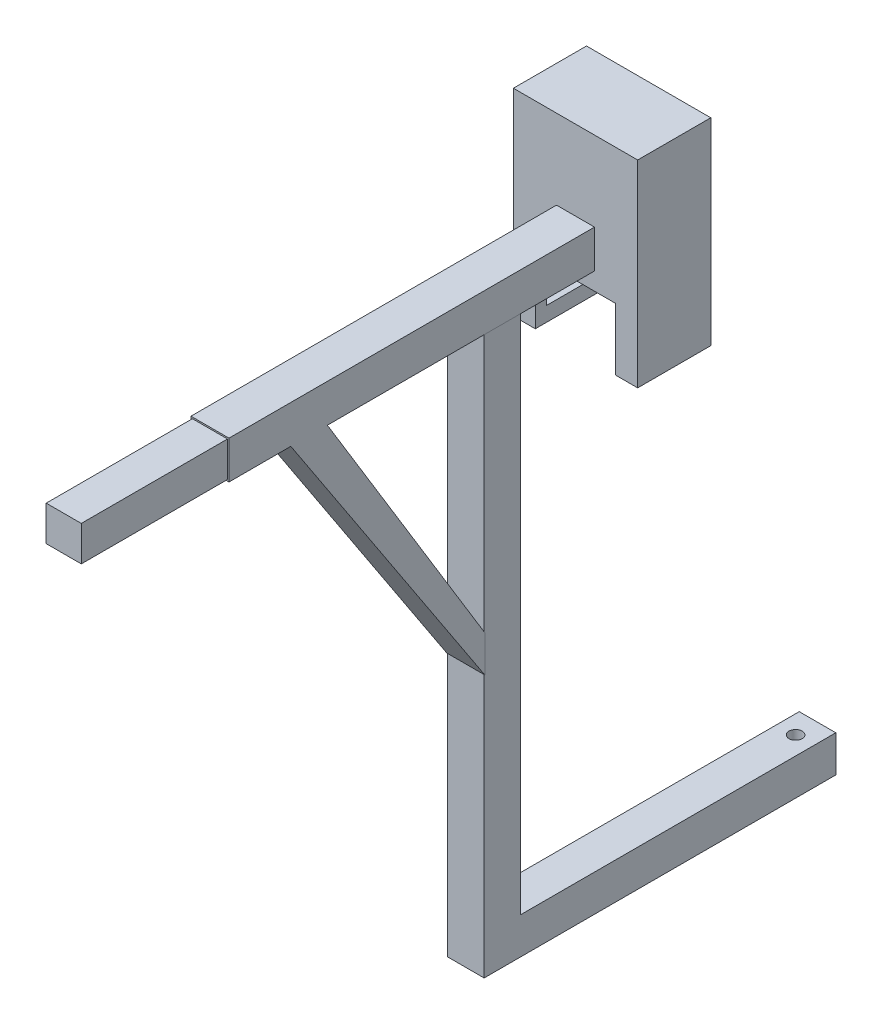
ISO-10303-21;
HEADER;
FILE_DESCRIPTION(('STEP AP214'),'2;1');
FILE_NAME('part.step','',(''),(''),'','','');
FILE_SCHEMA(('AUTOMOTIVE_DESIGN { 1 0 10303 214 1 1 1 1 }'));
ENDSEC;
DATA;
#1=APPLICATION_CONTEXT('core data for automotive mechanical design processes');
#2=APPLICATION_PROTOCOL_DEFINITION('international standard','automotive_design',2000,#1);
#3=PRODUCT_CONTEXT('',#1,'mechanical');
#4=PRODUCT('Part','Part','',(#3));
#5=PRODUCT_RELATED_PRODUCT_CATEGORY('part','',(#4));
#6=PRODUCT_DEFINITION_FORMATION('','',#4);
#7=PRODUCT_DEFINITION_CONTEXT('part definition',#1,'design');
#8=PRODUCT_DEFINITION('design','',#6,#7);
#9=PRODUCT_DEFINITION_SHAPE('','',#8);
#10=(LENGTH_UNIT() NAMED_UNIT(*) SI_UNIT(.MILLI.,.METRE.));
#11=(NAMED_UNIT(*) PLANE_ANGLE_UNIT() SI_UNIT($,.RADIAN.));
#12=(NAMED_UNIT(*) SI_UNIT($,.STERADIAN.) SOLID_ANGLE_UNIT());
#13=UNCERTAINTY_MEASURE_WITH_UNIT(LENGTH_MEASURE(1.E-05),#10,'distance_accuracy_value','');
#14=(GEOMETRIC_REPRESENTATION_CONTEXT(3) GLOBAL_UNCERTAINTY_ASSIGNED_CONTEXT((#13)) GLOBAL_UNIT_ASSIGNED_CONTEXT((#10,
#11,#12)) REPRESENTATION_CONTEXT('',''));
#15=CARTESIAN_POINT('',(0.,0.,0.));
#16=DIRECTION('',(0.,0.,1.));
#17=DIRECTION('',(1.,0.,0.));
#18=AXIS2_PLACEMENT_3D('',#15,#16,#17);
#19=CARTESIAN_POINT('',(5.,-5.,-50.));
#20=DIRECTION('',(0.,1.,0.));
#21=DIRECTION('',(-1.,0.,0.));
#22=AXIS2_PLACEMENT_3D('',#19,#20,#21);
#23=PLANE('',#22);
#24=DIRECTION('',(1.,0.,0.));
#25=VECTOR('',#24,1.);
#26=CARTESIAN_POINT('',(5.,-5.,-35.));
#27=LINE('',#26,#25);
#28=CARTESIAN_POINT('',(-0.100000000000001,-5.,-35.));
#29=VERTEX_POINT('',#28);
#30=CARTESIAN_POINT('',(4.9,-5.,-35.));
#31=VERTEX_POINT('',#30);
#32=EDGE_CURVE('E48',#29,#31,#27,.T.);
#33=ORIENTED_EDGE('',*,*,#32,.T.);
#34=DIRECTION('',(0.,0.,-1.));
#35=VECTOR('',#34,1.);
#36=CARTESIAN_POINT('',(4.9,-5.,-50.));
#37=LINE('',#36,#35);
#38=CARTESIAN_POINT('',(4.9,-5.,-40.));
#39=VERTEX_POINT('',#38);
#40=EDGE_CURVE('E11',#31,#39,#37,.T.);
#41=ORIENTED_EDGE('',*,*,#40,.T.);
#42=DIRECTION('',(-1.,0.,0.));
#43=VECTOR('',#42,1.);
#44=CARTESIAN_POINT('',(5.,-5.,-40.));
#45=LINE('',#44,#43);
#46=CARTESIAN_POINT('',(-0.100000000000037,-5.,-40.));
#47=VERTEX_POINT('',#46);
#48=EDGE_CURVE('E521',#39,#47,#45,.T.);
#49=ORIENTED_EDGE('',*,*,#48,.T.);
#50=DIRECTION('',(0.,0.,1.));
#51=VECTOR('',#50,1.);
#52=CARTESIAN_POINT('',(-0.100000000000003,-5.,-50.));
#53=LINE('',#52,#51);
#54=EDGE_CURVE('E524',#47,#29,#53,.T.);
#55=ORIENTED_EDGE('',*,*,#54,.T.);
#56=EDGE_LOOP('',(#33,#41,#49,#55));
#57=FACE_BOUND('',#56,.T.);
#58=DIRECTION('',(0.,0.,1.));
#59=VECTOR('',#58,1.);
#60=CARTESIAN_POINT('',(5.,-5.,-50.));
#61=LINE('',#60,#59);
#62=CARTESIAN_POINT('',(5.,-5.,-50.));
#63=VERTEX_POINT('',#62);
#64=CARTESIAN_POINT('',(5.,-5.,-13.4557829683408));
#65=VERTEX_POINT('',#64);
#66=EDGE_CURVE('E55',#63,#65,#61,.T.);
#67=ORIENTED_EDGE('',*,*,#66,.T.);
#68=DIRECTION('',(1.,0.,0.));
#69=VECTOR('',#68,1.);
#70=CARTESIAN_POINT('',(-0.2,-5.,-13.4557829683408));
#71=LINE('',#70,#69);
#72=CARTESIAN_POINT('',(-0.2,-5.,-13.4557829683408));
#73=VERTEX_POINT('',#72);
#74=EDGE_CURVE('E301',#73,#65,#71,.T.);
#75=ORIENTED_EDGE('',*,*,#74,.F.);
#76=DIRECTION('',(0.,0.,1.));
#77=VECTOR('',#76,1.);
#78=CARTESIAN_POINT('',(-0.2,-5.,-50.));
#79=LINE('',#78,#77);
#80=CARTESIAN_POINT('',(-0.2,-5.,-50.));
#81=VERTEX_POINT('',#80);
#82=EDGE_CURVE('E467',#81,#73,#79,.T.);
#83=ORIENTED_EDGE('',*,*,#82,.F.);
#84=DIRECTION('',(-1.,0.,0.));
#85=VECTOR('',#84,1.);
#86=CARTESIAN_POINT('',(5.,-5.,-50.));
#87=LINE('',#86,#85);
#88=EDGE_CURVE('E457',#63,#81,#87,.T.);
#89=ORIENTED_EDGE('',*,*,#88,.F.);
#90=EDGE_LOOP('',(#67,#75,#83,#89));
#91=FACE_BOUND('',#90,.T.);
#92=ADVANCED_FACE('F39',(#57,#91),#23,.F.);
#93=CARTESIAN_POINT('',(-0.100000000000036,-81.3,-35.));
#94=DIRECTION('',(0.,0.,1.));
#95=DIRECTION('',(1.,0.,0.));
#96=AXIS2_PLACEMENT_3D('',#93,#94,#95);
#97=PLANE('',#96);
#98=DIRECTION('',(1.,0.,0.));
#99=VECTOR('',#98,1.);
#100=CARTESIAN_POINT('',(-0.2,-40.359932103338,-35.));
#101=LINE('',#100,#99);
#102=CARTESIAN_POINT('',(-0.100000000000017,-40.359932103338,-35.));
#103=VERTEX_POINT('',#102);
#104=CARTESIAN_POINT('',(4.9,-40.359932103338,-35.));
#105=VERTEX_POINT('',#104);
#106=EDGE_CURVE('E305',#103,#105,#101,.T.);
#107=ORIENTED_EDGE('',*,*,#106,.T.);
#108=DIRECTION('',(0.,1.,0.));
#109=VECTOR('',#108,1.);
#110=CARTESIAN_POINT('',(4.89999999999996,-81.3,-35.));
#111=LINE('',#110,#109);
#112=EDGE_CURVE('E344',#105,#31,#111,.T.);
#113=ORIENTED_EDGE('',*,*,#112,.T.);
#114=ORIENTED_EDGE('',*,*,#32,.F.);
#115=DIRECTION('',(0.,1.,0.));
#116=VECTOR('',#115,1.);
#117=CARTESIAN_POINT('',(-0.100000000000036,-81.3,-35.));
#118=LINE('',#117,#116);
#119=EDGE_CURVE('E348',#103,#29,#118,.T.);
#120=ORIENTED_EDGE('',*,*,#119,.F.);
#121=EDGE_LOOP('',(#107,#113,#114,#120));
#122=FACE_BOUND('',#121,.T.);
#123=ADVANCED_FACE('F535',(#122),#97,.T.);
#124=CARTESIAN_POINT('',(-0.100000000000036,-81.3,-40.));
#125=DIRECTION('',(0.,0.,-1.));
#126=DIRECTION('',(-1.,0.,0.));
#127=AXIS2_PLACEMENT_3D('',#124,#125,#126);
#128=PLANE('',#127);
#129=DIRECTION('',(0.,1.,0.));
#130=VECTOR('',#129,1.);
#131=CARTESIAN_POINT('',(4.89999999999996,-81.3,-40.));
#132=LINE('',#131,#130);
#133=CARTESIAN_POINT('',(4.89999999999997,-76.3,-40.));
#134=VERTEX_POINT('',#133);
#135=EDGE_CURVE('E339',#134,#39,#132,.T.);
#136=ORIENTED_EDGE('',*,*,#135,.F.);
#137=DIRECTION('',(1.,0.,0.));
#138=VECTOR('',#137,1.);
#139=CARTESIAN_POINT('',(4.89999999999996,-76.3,-40.));
#140=LINE('',#139,#138);
#141=CARTESIAN_POINT('',(-0.100000000000034,-76.3,-40.));
#142=VERTEX_POINT('',#141);
#143=EDGE_CURVE('E316',#142,#134,#140,.T.);
#144=ORIENTED_EDGE('',*,*,#143,.F.);
#145=DIRECTION('',(0.,1.,0.));
#146=VECTOR('',#145,1.);
#147=CARTESIAN_POINT('',(-0.100000000000036,-81.3,-40.));
#148=LINE('',#147,#146);
#149=EDGE_CURVE('E349',#142,#47,#148,.T.);
#150=ORIENTED_EDGE('',*,*,#149,.T.);
#151=ORIENTED_EDGE('',*,*,#48,.F.);
#152=EDGE_LOOP('',(#136,#144,#150,#151));
#153=FACE_BOUND('',#152,.T.);
#154=ADVANCED_FACE('F545',(#153),#128,.T.);
#155=CARTESIAN_POINT('',(0.,0.,20.));
#156=DIRECTION('',(1.,0.,0.));
#157=DIRECTION('',(0.,0.,-1.));
#158=AXIS2_PLACEMENT_3D('',#155,#156,#157);
#159=PLANE('',#158);
#160=DIRECTION('',(0.,-1.,0.));
#161=VECTOR('',#160,1.);
#162=CARTESIAN_POINT('',(0.,0.,0.));
#163=LINE('',#162,#161);
#164=CARTESIAN_POINT('',(0.,0.,0.));
#165=VERTEX_POINT('',#164);
#166=CARTESIAN_POINT('',(0.,-4.8,0.));
#167=VERTEX_POINT('',#166);
#168=EDGE_CURVE('E477',#165,#167,#163,.T.);
#169=ORIENTED_EDGE('',*,*,#168,.T.);
#170=DIRECTION('',(0.,0.,-1.));
#171=VECTOR('',#170,1.);
#172=CARTESIAN_POINT('',(0.,-4.8,20.));
#173=LINE('',#172,#171);
#174=CARTESIAN_POINT('',(0.,-4.8,20.));
#175=VERTEX_POINT('',#174);
#176=EDGE_CURVE('E507',#175,#167,#173,.T.);
#177=ORIENTED_EDGE('',*,*,#176,.F.);
#178=DIRECTION('',(0.,-1.,0.));
#179=VECTOR('',#178,1.);
#180=CARTESIAN_POINT('',(0.,0.,20.));
#181=LINE('',#180,#179);
#182=CARTESIAN_POINT('',(0.,0.,20.));
#183=VERTEX_POINT('',#182);
#184=EDGE_CURVE('E478',#183,#175,#181,.T.);
#185=ORIENTED_EDGE('',*,*,#184,.F.);
#186=DIRECTION('',(0.,0.,-1.));
#187=VECTOR('',#186,1.);
#188=CARTESIAN_POINT('',(0.,0.,20.));
#189=LINE('',#188,#187);
#190=EDGE_CURVE('E488',#183,#165,#189,.T.);
#191=ORIENTED_EDGE('',*,*,#190,.T.);
#192=EDGE_LOOP('',(#169,#177,#185,#191));
#193=FACE_BOUND('',#192,.T.);
#194=ADVANCED_FACE('F41',(#193),#159,.F.);
#195=CARTESIAN_POINT('',(0.,-4.8,20.));
#196=DIRECTION('',(0.,1.,0.));
#197=DIRECTION('',(0.,0.,1.));
#198=AXIS2_PLACEMENT_3D('',#195,#196,#197);
#199=PLANE('',#198);
#200=DIRECTION('',(1.,0.,0.));
#201=VECTOR('',#200,1.);
#202=CARTESIAN_POINT('',(0.,-4.8,0.));
#203=LINE('',#202,#201);
#204=CARTESIAN_POINT('',(4.79999999999998,-4.8,0.));
#205=VERTEX_POINT('',#204);
#206=EDGE_CURVE('E491',#167,#205,#203,.T.);
#207=ORIENTED_EDGE('',*,*,#206,.T.);
#208=DIRECTION('',(0.,0.,-1.));
#209=VECTOR('',#208,1.);
#210=CARTESIAN_POINT('',(4.79999999999998,-4.8,20.));
#211=LINE('',#210,#209);
#212=CARTESIAN_POINT('',(4.79999999999998,-4.8,20.));
#213=VERTEX_POINT('',#212);
#214=EDGE_CURVE('E504',#213,#205,#211,.T.);
#215=ORIENTED_EDGE('',*,*,#214,.F.);
#216=DIRECTION('',(1.,0.,0.));
#217=VECTOR('',#216,1.);
#218=CARTESIAN_POINT('',(0.,-4.8,20.));
#219=LINE('',#218,#217);
#220=EDGE_CURVE('E481',#175,#213,#219,.T.);
#221=ORIENTED_EDGE('',*,*,#220,.F.);
#222=ORIENTED_EDGE('',*,*,#176,.T.);
#223=EDGE_LOOP('',(#207,#215,#221,#222));
#224=FACE_BOUND('',#223,.T.);
#225=ADVANCED_FACE('F721',(#224),#199,.F.);
#226=CARTESIAN_POINT('',(4.79999999999998,0.,20.));
#227=DIRECTION('',(-1.,0.,0.));
#228=DIRECTION('',(0.,0.,1.));
#229=AXIS2_PLACEMENT_3D('',#226,#227,#228);
#230=PLANE('',#229);
#231=DIRECTION('',(0.,1.,0.));
#232=VECTOR('',#231,1.);
#233=CARTESIAN_POINT('',(4.79999999999998,0.,0.));
#234=LINE('',#233,#232);
#235=CARTESIAN_POINT('',(4.79999999999998,0.,0.));
#236=VERTEX_POINT('',#235);
#237=EDGE_CURVE('E494',#205,#236,#234,.T.);
#238=ORIENTED_EDGE('',*,*,#237,.T.);
#239=DIRECTION('',(0.,0.,-1.));
#240=VECTOR('',#239,1.);
#241=CARTESIAN_POINT('',(4.79999999999998,0.,20.));
#242=LINE('',#241,#240);
#243=CARTESIAN_POINT('',(4.79999999999998,0.,20.));
#244=VERTEX_POINT('',#243);
#245=EDGE_CURVE('E501',#244,#236,#242,.T.);
#246=ORIENTED_EDGE('',*,*,#245,.F.);
#247=DIRECTION('',(0.,1.,0.));
#248=VECTOR('',#247,1.);
#249=CARTESIAN_POINT('',(4.79999999999998,0.,20.));
#250=LINE('',#249,#248);
#251=EDGE_CURVE('E484',#213,#244,#250,.T.);
#252=ORIENTED_EDGE('',*,*,#251,.F.);
#253=ORIENTED_EDGE('',*,*,#214,.T.);
#254=EDGE_LOOP('',(#238,#246,#252,#253));
#255=FACE_BOUND('',#254,.T.);
#256=ADVANCED_FACE('F718',(#255),#230,.F.);
#257=CARTESIAN_POINT('',(0.,0.,20.));
#258=DIRECTION('',(0.,-1.,0.));
#259=DIRECTION('',(0.,0.,-1.));
#260=AXIS2_PLACEMENT_3D('',#257,#258,#259);
#261=PLANE('',#260);
#262=DIRECTION('',(-1.,0.,0.));
#263=VECTOR('',#262,1.);
#264=CARTESIAN_POINT('',(0.,0.,0.));
#265=LINE('',#264,#263);
#266=EDGE_CURVE('E482',#236,#165,#265,.T.);
#267=ORIENTED_EDGE('',*,*,#266,.T.);
#268=ORIENTED_EDGE('',*,*,#190,.F.);
#269=DIRECTION('',(-1.,0.,0.));
#270=VECTOR('',#269,1.);
#271=CARTESIAN_POINT('',(0.,0.,20.));
#272=LINE('',#271,#270);
#273=EDGE_CURVE('E486',#244,#183,#272,.T.);
#274=ORIENTED_EDGE('',*,*,#273,.F.);
#275=ORIENTED_EDGE('',*,*,#245,.T.);
#276=EDGE_LOOP('',(#267,#268,#274,#275));
#277=FACE_BOUND('',#276,.T.);
#278=ADVANCED_FACE('F714',(#277),#261,.F.);
#279=CARTESIAN_POINT('',(0.,0.,20.));
#280=DIRECTION('',(0.,0.,1.));
#281=DIRECTION('',(1.,0.,0.));
#282=AXIS2_PLACEMENT_3D('',#279,#280,#281);
#283=PLANE('',#282);
#284=ORIENTED_EDGE('',*,*,#184,.T.);
#285=ORIENTED_EDGE('',*,*,#220,.T.);
#286=ORIENTED_EDGE('',*,*,#251,.T.);
#287=ORIENTED_EDGE('',*,*,#273,.T.);
#288=EDGE_LOOP('',(#284,#285,#286,#287));
#289=FACE_BOUND('',#288,.T.);
#290=ADVANCED_FACE('F709',(#289),#283,.T.);
#291=CARTESIAN_POINT('',(-0.199999999999999,0.199999999999999,-50.));
#292=DIRECTION('',(1.,0.,0.));
#293=DIRECTION('',(0.,1.,0.));
#294=AXIS2_PLACEMENT_3D('',#291,#292,#293);
#295=PLANE('',#294);
#296=DIRECTION('',(0.,1.,0.));
#297=VECTOR('',#296,1.);
#298=CARTESIAN_POINT('',(-0.199999999999999,0.199999999999999,0.));
#299=LINE('',#298,#297);
#300=CARTESIAN_POINT('',(-0.2,-5.,0.));
#301=VERTEX_POINT('',#300);
#302=CARTESIAN_POINT('',(-0.199999999999999,0.199999999999999,0.));
#303=VERTEX_POINT('',#302);
#304=EDGE_CURVE('E446',#301,#303,#299,.T.);
#305=ORIENTED_EDGE('',*,*,#304,.T.);
#306=DIRECTION('',(0.,0.,1.));
#307=VECTOR('',#306,1.);
#308=CARTESIAN_POINT('',(-0.199999999999999,0.199999999999999,-50.));
#309=LINE('',#308,#307);
#310=CARTESIAN_POINT('',(-0.199999999999999,0.199999999999999,-50.));
#311=VERTEX_POINT('',#310);
#312=EDGE_CURVE('E474',#311,#303,#309,.T.);
#313=ORIENTED_EDGE('',*,*,#312,.F.);
#314=DIRECTION('',(0.,1.,0.));
#315=VECTOR('',#314,1.);
#316=CARTESIAN_POINT('',(-0.199999999999999,0.199999999999999,-50.));
#317=LINE('',#316,#315);
#318=EDGE_CURVE('E447',#81,#311,#317,.T.);
#319=ORIENTED_EDGE('',*,*,#318,.F.);
#320=ORIENTED_EDGE('',*,*,#82,.T.);
#321=DIRECTION('',(0.,0.853975582543148,0.520313083076038));
#322=VECTOR('',#321,1.);
#323=CARTESIAN_POINT('',(-0.2,-5.,-13.4557829683408));
#324=LINE('',#323,#322);
#325=CARTESIAN_POINT('',(-0.2,-40.359932103338,-35.));
#326=VERTEX_POINT('',#325);
#327=EDGE_CURVE('E284',#326,#73,#324,.T.);
#328=ORIENTED_EDGE('',*,*,#327,.F.);
#329=DIRECTION('',(0.,1.,0.));
#330=VECTOR('',#329,1.);
#331=CARTESIAN_POINT('',(-0.2,-40.359932103338,-35.));
#332=LINE('',#331,#330);
#333=CARTESIAN_POINT('',(-0.2,-45.359932103338,-35.));
#334=VERTEX_POINT('',#333);
#335=EDGE_CURVE('E265',#334,#326,#332,.T.);
#336=ORIENTED_EDGE('',*,*,#335,.F.);
#337=DIRECTION('',(0.,-0.835496630151648,-0.549495569595644));
#338=VECTOR('',#337,1.);
#339=CARTESIAN_POINT('',(-0.2,-5.,-8.45578296834082));
#340=LINE('',#339,#338);
#341=CARTESIAN_POINT('',(-0.2,-5.,-8.45578296834083));
#342=VERTEX_POINT('',#341);
#343=EDGE_CURVE('E281',#342,#334,#340,.T.);
#344=ORIENTED_EDGE('',*,*,#343,.F.);
#345=EDGE_CURVE('E63',#342,#301,#79,.T.);
#346=ORIENTED_EDGE('',*,*,#345,.T.);
#347=EDGE_LOOP('',(#305,#313,#319,#320,#328,#336,#344,#346));
#348=FACE_BOUND('',#347,.T.);
#349=ADVANCED_FACE('F280',(#348),#295,.F.);
#350=CARTESIAN_POINT('',(5.,0.199999999999997,-50.));
#351=DIRECTION('',(0.,-1.,0.));
#352=DIRECTION('',(1.,0.,0.));
#353=AXIS2_PLACEMENT_3D('',#350,#351,#352);
#354=PLANE('',#353);
#355=DIRECTION('',(1.,0.,0.));
#356=VECTOR('',#355,1.);
#357=CARTESIAN_POINT('',(5.,0.199999999999997,0.));
#358=LINE('',#357,#356);
#359=CARTESIAN_POINT('',(5.,0.199999999999997,0.));
#360=VERTEX_POINT('',#359);
#361=EDGE_CURVE('E461',#303,#360,#358,.T.);
#362=ORIENTED_EDGE('',*,*,#361,.T.);
#363=DIRECTION('',(0.,0.,1.));
#364=VECTOR('',#363,1.);
#365=CARTESIAN_POINT('',(5.,0.199999999999997,-50.));
#366=LINE('',#365,#364);
#367=CARTESIAN_POINT('',(5.,0.199999999999997,-50.));
#368=VERTEX_POINT('',#367);
#369=EDGE_CURVE('E471',#368,#360,#366,.T.);
#370=ORIENTED_EDGE('',*,*,#369,.F.);
#371=DIRECTION('',(1.,0.,0.));
#372=VECTOR('',#371,1.);
#373=CARTESIAN_POINT('',(5.,0.199999999999997,-50.));
#374=LINE('',#373,#372);
#375=EDGE_CURVE('E450',#311,#368,#374,.T.);
#376=ORIENTED_EDGE('',*,*,#375,.F.);
#377=ORIENTED_EDGE('',*,*,#312,.T.);
#378=EDGE_LOOP('',(#362,#370,#376,#377));
#379=FACE_BOUND('',#378,.T.);
#380=ADVANCED_FACE('F576',(#379),#354,.F.);
#381=CARTESIAN_POINT('',(5.,0.199999999999997,-50.));
#382=DIRECTION('',(-1.,0.,0.));
#383=DIRECTION('',(0.,0.,1.));
#384=AXIS2_PLACEMENT_3D('',#381,#382,#383);
#385=PLANE('',#384);
#386=DIRECTION('',(0.,-1.,0.));
#387=VECTOR('',#386,1.);
#388=CARTESIAN_POINT('',(5.,0.199999999999997,0.));
#389=LINE('',#388,#387);
#390=CARTESIAN_POINT('',(5.,-5.,0.));
#391=VERTEX_POINT('',#390);
#392=EDGE_CURVE('E463',#360,#391,#389,.T.);
#393=ORIENTED_EDGE('',*,*,#392,.T.);
#394=CARTESIAN_POINT('',(5.,-5.,-8.45578296834082));
#395=VERTEX_POINT('',#394);
#396=EDGE_CURVE('E469',#395,#391,#61,.T.);
#397=ORIENTED_EDGE('',*,*,#396,.F.);
#398=DIRECTION('',(0.,-0.835496630151648,-0.549495569595644));
#399=VECTOR('',#398,1.);
#400=CARTESIAN_POINT('',(5.,-5.,-8.45578296834082));
#401=LINE('',#400,#399);
#402=CARTESIAN_POINT('',(5.,-45.359932103338,-35.));
#403=VERTEX_POINT('',#402);
#404=EDGE_CURVE('E296',#395,#403,#401,.T.);
#405=ORIENTED_EDGE('',*,*,#404,.T.);
#406=DIRECTION('',(0.,1.,0.));
#407=VECTOR('',#406,1.);
#408=CARTESIAN_POINT('',(5.,-40.359932103338,-35.));
#409=LINE('',#408,#407);
#410=CARTESIAN_POINT('',(5.,-40.359932103338,-35.));
#411=VERTEX_POINT('',#410);
#412=EDGE_CURVE('E292',#403,#411,#409,.T.);
#413=ORIENTED_EDGE('',*,*,#412,.T.);
#414=DIRECTION('',(0.,0.853975582543148,0.520313083076038));
#415=VECTOR('',#414,1.);
#416=CARTESIAN_POINT('',(5.,-5.,-13.4557829683408));
#417=LINE('',#416,#415);
#418=EDGE_CURVE('E289',#411,#65,#417,.T.);
#419=ORIENTED_EDGE('',*,*,#418,.T.);
#420=ORIENTED_EDGE('',*,*,#66,.F.);
#421=DIRECTION('',(0.,-1.,0.));
#422=VECTOR('',#421,1.);
#423=CARTESIAN_POINT('',(5.,0.199999999999997,-50.));
#424=LINE('',#423,#422);
#425=EDGE_CURVE('E454',#368,#63,#424,.T.);
#426=ORIENTED_EDGE('',*,*,#425,.F.);
#427=ORIENTED_EDGE('',*,*,#369,.T.);
#428=EDGE_LOOP('',(#393,#397,#405,#413,#419,#420,#426,#427));
#429=FACE_BOUND('',#428,.T.);
#430=ADVANCED_FACE('F560',(#429),#385,.F.);
#431=ORIENTED_EDGE('',*,*,#345,.F.);
#432=DIRECTION('',(1.,0.,0.));
#433=VECTOR('',#432,1.);
#434=CARTESIAN_POINT('',(-0.2,-5.,-8.45578296834082));
#435=LINE('',#434,#433);
#436=EDGE_CURVE('E288',#342,#395,#435,.T.);
#437=ORIENTED_EDGE('',*,*,#436,.T.);
#438=ORIENTED_EDGE('',*,*,#396,.T.);
#439=DIRECTION('',(-1.,0.,0.));
#440=VECTOR('',#439,1.);
#441=CARTESIAN_POINT('',(5.,-5.,0.));
#442=LINE('',#441,#440);
#443=EDGE_CURVE('E451',#391,#301,#442,.T.);
#444=ORIENTED_EDGE('',*,*,#443,.T.);
#445=EDGE_LOOP('',(#431,#437,#438,#444));
#446=FACE_BOUND('',#445,.T.);
#447=ADVANCED_FACE('F563',(#446),#23,.F.);
#448=CARTESIAN_POINT('',(0.,0.,0.));
#449=DIRECTION('',(0.,0.,-1.));
#450=DIRECTION('',(-1.,0.,0.));
#451=AXIS2_PLACEMENT_3D('',#448,#449,#450);
#452=PLANE('',#451);
#453=ORIENTED_EDGE('',*,*,#168,.F.);
#454=ORIENTED_EDGE('',*,*,#266,.F.);
#455=ORIENTED_EDGE('',*,*,#237,.F.);
#456=ORIENTED_EDGE('',*,*,#206,.F.);
#457=EDGE_LOOP('',(#453,#454,#455,#456));
#458=FACE_BOUND('',#457,.T.);
#459=ORIENTED_EDGE('',*,*,#304,.F.);
#460=ORIENTED_EDGE('',*,*,#443,.F.);
#461=ORIENTED_EDGE('',*,*,#392,.F.);
#462=ORIENTED_EDGE('',*,*,#361,.F.);
#463=EDGE_LOOP('',(#459,#460,#461,#462));
#464=FACE_BOUND('',#463,.T.);
#465=ADVANCED_FACE('F565',(#458,#464),#452,.F.);
#466=CARTESIAN_POINT('',(0.,0.,-50.));
#467=DIRECTION('',(0.,0.,-1.));
#468=DIRECTION('',(-1.,0.,0.));
#469=AXIS2_PLACEMENT_3D('',#466,#467,#468);
#470=PLANE('',#469);
#471=DIRECTION('',(-1.,0.,0.));
#472=VECTOR('',#471,1.);
#473=CARTESIAN_POINT('',(10.9,-15.9,-50.));
#474=LINE('',#473,#472);
#475=CARTESIAN_POINT('',(-3.1,-15.9,-50.));
#476=VERTEX_POINT('',#475);
#477=CARTESIAN_POINT('',(-6.1,-15.9,-50.));
#478=VERTEX_POINT('',#477);
#479=EDGE_CURVE('E432',#476,#478,#474,.T.);
#480=ORIENTED_EDGE('',*,*,#479,.F.);
#481=DIRECTION('',(0.,-1.,0.));
#482=VECTOR('',#481,1.);
#483=CARTESIAN_POINT('',(-3.1,-7.4,-50.));
#484=LINE('',#483,#482);
#485=CARTESIAN_POINT('',(-3.1,-7.4,-50.));
#486=VERTEX_POINT('',#485);
#487=EDGE_CURVE('E366',#486,#476,#484,.T.);
#488=ORIENTED_EDGE('',*,*,#487,.F.);
#489=DIRECTION('',(-1.,0.,0.));
#490=VECTOR('',#489,1.);
#491=CARTESIAN_POINT('',(-3.1,-7.4,-50.));
#492=LINE('',#491,#490);
#493=CARTESIAN_POINT('',(7.9,-7.4,-50.));
#494=VERTEX_POINT('',#493);
#495=EDGE_CURVE('E357',#494,#486,#492,.T.);
#496=ORIENTED_EDGE('',*,*,#495,.F.);
#497=DIRECTION('',(0.,-1.,0.));
#498=VECTOR('',#497,1.);
#499=CARTESIAN_POINT('',(7.9,-7.4,-50.));
#500=LINE('',#499,#498);
#501=CARTESIAN_POINT('',(7.9,-15.9,-50.));
#502=VERTEX_POINT('',#501);
#503=EDGE_CURVE('E369',#494,#502,#500,.T.);
#504=ORIENTED_EDGE('',*,*,#503,.T.);
#505=CARTESIAN_POINT('',(10.9,-15.9,-50.));
#506=VERTEX_POINT('',#505);
#507=EDGE_CURVE('E419',#506,#502,#474,.T.);
#508=ORIENTED_EDGE('',*,*,#507,.F.);
#509=DIRECTION('',(0.,-1.,0.));
#510=VECTOR('',#509,1.);
#511=CARTESIAN_POINT('',(10.9,11.1,-50.));
#512=LINE('',#511,#510);
#513=CARTESIAN_POINT('',(10.9,11.1,-50.));
#514=VERTEX_POINT('',#513);
#515=EDGE_CURVE('E430',#514,#506,#512,.T.);
#516=ORIENTED_EDGE('',*,*,#515,.F.);
#517=DIRECTION('',(1.,0.,0.));
#518=VECTOR('',#517,1.);
#519=CARTESIAN_POINT('',(10.9,11.1,-50.));
#520=LINE('',#519,#518);
#521=CARTESIAN_POINT('',(-6.1,11.1,-50.));
#522=VERTEX_POINT('',#521);
#523=EDGE_CURVE('E428',#522,#514,#520,.T.);
#524=ORIENTED_EDGE('',*,*,#523,.F.);
#525=DIRECTION('',(0.,1.,0.));
#526=VECTOR('',#525,1.);
#527=CARTESIAN_POINT('',(-6.1,11.1,-50.));
#528=LINE('',#527,#526);
#529=EDGE_CURVE('E408',#478,#522,#528,.T.);
#530=ORIENTED_EDGE('',*,*,#529,.F.);
#531=EDGE_LOOP('',(#480,#488,#496,#504,#508,#516,#524,#530));
#532=FACE_BOUND('',#531,.T.);
#533=ORIENTED_EDGE('',*,*,#88,.T.);
#534=ORIENTED_EDGE('',*,*,#318,.T.);
#535=ORIENTED_EDGE('',*,*,#375,.T.);
#536=ORIENTED_EDGE('',*,*,#425,.T.);
#537=EDGE_LOOP('',(#533,#534,#535,#536));
#538=FACE_BOUND('',#537,.T.);
#539=ADVANCED_FACE('F572',(#532,#538),#470,.F.);
#540=CARTESIAN_POINT('',(-6.1,11.1,-60.));
#541=DIRECTION('',(1.,0.,0.));
#542=DIRECTION('',(0.,1.,0.));
#543=AXIS2_PLACEMENT_3D('',#540,#541,#542);
#544=PLANE('',#543);
#545=ORIENTED_EDGE('',*,*,#529,.T.);
#546=DIRECTION('',(0.,0.,1.));
#547=VECTOR('',#546,1.);
#548=CARTESIAN_POINT('',(-6.1,11.1,-60.));
#549=LINE('',#548,#547);
#550=CARTESIAN_POINT('',(-6.1,11.1,-60.));
#551=VERTEX_POINT('',#550);
#552=EDGE_CURVE('E443',#551,#522,#549,.T.);
#553=ORIENTED_EDGE('',*,*,#552,.F.);
#554=DIRECTION('',(0.,1.,0.));
#555=VECTOR('',#554,1.);
#556=CARTESIAN_POINT('',(-6.1,11.1,-60.));
#557=LINE('',#556,#555);
#558=CARTESIAN_POINT('',(-6.1,-15.9,-60.));
#559=VERTEX_POINT('',#558);
#560=EDGE_CURVE('E415',#559,#551,#557,.T.);
#561=ORIENTED_EDGE('',*,*,#560,.F.);
#562=DIRECTION('',(0.,0.,1.));
#563=VECTOR('',#562,1.);
#564=CARTESIAN_POINT('',(-6.1,-15.9,-60.));
#565=LINE('',#564,#563);
#566=EDGE_CURVE('E425',#559,#478,#565,.T.);
#567=ORIENTED_EDGE('',*,*,#566,.T.);
#568=EDGE_LOOP('',(#545,#553,#561,#567));
#569=FACE_BOUND('',#568,.T.);
#570=ADVANCED_FACE('F643',(#569),#544,.F.);
#571=CARTESIAN_POINT('',(10.9,11.1,-60.));
#572=DIRECTION('',(0.,-1.,0.));
#573=DIRECTION('',(0.,0.,-1.));
#574=AXIS2_PLACEMENT_3D('',#571,#572,#573);
#575=PLANE('',#574);
#576=ORIENTED_EDGE('',*,*,#523,.T.);
#577=DIRECTION('',(0.,0.,1.));
#578=VECTOR('',#577,1.);
#579=CARTESIAN_POINT('',(10.9,11.1,-60.));
#580=LINE('',#579,#578);
#581=CARTESIAN_POINT('',(10.9,11.1,-60.));
#582=VERTEX_POINT('',#581);
#583=EDGE_CURVE('E440',#582,#514,#580,.T.);
#584=ORIENTED_EDGE('',*,*,#583,.F.);
#585=DIRECTION('',(1.,0.,0.));
#586=VECTOR('',#585,1.);
#587=CARTESIAN_POINT('',(10.9,11.1,-60.));
#588=LINE('',#587,#586);
#589=EDGE_CURVE('E418',#551,#582,#588,.T.);
#590=ORIENTED_EDGE('',*,*,#589,.F.);
#591=ORIENTED_EDGE('',*,*,#552,.T.);
#592=EDGE_LOOP('',(#576,#584,#590,#591));
#593=FACE_BOUND('',#592,.T.);
#594=ADVANCED_FACE('F651',(#593),#575,.F.);
#595=CARTESIAN_POINT('',(10.9,11.1,-60.));
#596=DIRECTION('',(-1.,0.,0.));
#597=DIRECTION('',(0.,-1.,0.));
#598=AXIS2_PLACEMENT_3D('',#595,#596,#597);
#599=PLANE('',#598);
#600=ORIENTED_EDGE('',*,*,#515,.T.);
#601=DIRECTION('',(0.,0.,1.));
#602=VECTOR('',#601,1.);
#603=CARTESIAN_POINT('',(10.9,-15.9,-60.));
#604=LINE('',#603,#602);
#605=CARTESIAN_POINT('',(10.9,-15.9,-60.));
#606=VERTEX_POINT('',#605);
#607=EDGE_CURVE('E437',#606,#506,#604,.T.);
#608=ORIENTED_EDGE('',*,*,#607,.F.);
#609=DIRECTION('',(0.,-1.,0.));
#610=VECTOR('',#609,1.);
#611=CARTESIAN_POINT('',(10.9,11.1,-60.));
#612=LINE('',#611,#610);
#613=EDGE_CURVE('E421',#582,#606,#612,.T.);
#614=ORIENTED_EDGE('',*,*,#613,.F.);
#615=ORIENTED_EDGE('',*,*,#583,.T.);
#616=EDGE_LOOP('',(#600,#608,#614,#615));
#617=FACE_BOUND('',#616,.T.);
#618=ADVANCED_FACE('F647',(#617),#599,.F.);
#619=CARTESIAN_POINT('',(10.9,-15.9,-60.));
#620=DIRECTION('',(0.,1.,0.));
#621=DIRECTION('',(0.,0.,1.));
#622=AXIS2_PLACEMENT_3D('',#619,#620,#621);
#623=PLANE('',#622);
#624=DIRECTION('',(1.,0.,0.));
#625=VECTOR('',#624,1.);
#626=CARTESIAN_POINT('',(-3.1,-15.9,-58.5));
#627=LINE('',#626,#625);
#628=CARTESIAN_POINT('',(-3.1,-15.9,-58.5));
#629=VERTEX_POINT('',#628);
#630=CARTESIAN_POINT('',(7.9,-15.9,-58.5));
#631=VERTEX_POINT('',#630);
#632=EDGE_CURVE('E362',#629,#631,#627,.T.);
#633=ORIENTED_EDGE('',*,*,#632,.F.);
#634=DIRECTION('',(0.,0.,-1.));
#635=VECTOR('',#634,1.);
#636=CARTESIAN_POINT('',(-3.1,-15.9,-50.));
#637=LINE('',#636,#635);
#638=EDGE_CURVE('E343',#476,#629,#637,.T.);
#639=ORIENTED_EDGE('',*,*,#638,.F.);
#640=ORIENTED_EDGE('',*,*,#479,.T.);
#641=ORIENTED_EDGE('',*,*,#566,.F.);
#642=DIRECTION('',(-1.,0.,0.));
#643=VECTOR('',#642,1.);
#644=CARTESIAN_POINT('',(10.9,-15.9,-60.));
#645=LINE('',#644,#643);
#646=EDGE_CURVE('E423',#606,#559,#645,.T.);
#647=ORIENTED_EDGE('',*,*,#646,.F.);
#648=ORIENTED_EDGE('',*,*,#607,.T.);
#649=ORIENTED_EDGE('',*,*,#507,.T.);
#650=DIRECTION('',(0.,0.,1.));
#651=VECTOR('',#650,1.);
#652=CARTESIAN_POINT('',(7.9,-15.9,-50.));
#653=LINE('',#652,#651);
#654=EDGE_CURVE('E355',#631,#502,#653,.T.);
#655=ORIENTED_EDGE('',*,*,#654,.F.);
#656=EDGE_LOOP('',(#633,#639,#640,#641,#647,#648,#649,#655));
#657=FACE_BOUND('',#656,.T.);
#658=ADVANCED_FACE('F639',(#657),#623,.F.);
#659=CARTESIAN_POINT('',(0.,0.,-60.));
#660=DIRECTION('',(0.,0.,-1.));
#661=DIRECTION('',(-1.,0.,0.));
#662=AXIS2_PLACEMENT_3D('',#659,#660,#661);
#663=PLANE('',#662);
#664=DIRECTION('',(0.,-1.,0.));
#665=VECTOR('',#664,1.);
#666=CARTESIAN_POINT('',(8.9,9.09999999999999,-60.));
#667=LINE('',#666,#665);
#668=CARTESIAN_POINT('',(8.9,9.09999999999999,-60.));
#669=VERTEX_POINT('',#668);
#670=CARTESIAN_POINT('',(8.9,-13.9,-60.));
#671=VERTEX_POINT('',#670);
#672=EDGE_CURVE('E381',#669,#671,#667,.T.);
#673=ORIENTED_EDGE('',*,*,#672,.F.);
#674=DIRECTION('',(1.,0.,0.));
#675=VECTOR('',#674,1.);
#676=CARTESIAN_POINT('',(-4.1,9.1,-60.));
#677=LINE('',#676,#675);
#678=CARTESIAN_POINT('',(-4.1,9.1,-60.));
#679=VERTEX_POINT('',#678);
#680=EDGE_CURVE('E386',#679,#669,#677,.T.);
#681=ORIENTED_EDGE('',*,*,#680,.F.);
#682=DIRECTION('',(0.,1.,0.));
#683=VECTOR('',#682,1.);
#684=CARTESIAN_POINT('',(-4.1,9.1,-60.));
#685=LINE('',#684,#683);
#686=CARTESIAN_POINT('',(-4.1,-13.9,-60.));
#687=VERTEX_POINT('',#686);
#688=EDGE_CURVE('E401',#687,#679,#685,.T.);
#689=ORIENTED_EDGE('',*,*,#688,.F.);
#690=DIRECTION('',(-1.,0.,0.));
#691=VECTOR('',#690,1.);
#692=CARTESIAN_POINT('',(-4.1,-13.9,-60.));
#693=LINE('',#692,#691);
#694=EDGE_CURVE('E398',#671,#687,#693,.T.);
#695=ORIENTED_EDGE('',*,*,#694,.F.);
#696=EDGE_LOOP('',(#673,#681,#689,#695));
#697=FACE_BOUND('',#696,.T.);
#698=ORIENTED_EDGE('',*,*,#560,.T.);
#699=ORIENTED_EDGE('',*,*,#589,.T.);
#700=ORIENTED_EDGE('',*,*,#613,.T.);
#701=ORIENTED_EDGE('',*,*,#646,.T.);
#702=EDGE_LOOP('',(#698,#699,#700,#701));
#703=FACE_BOUND('',#702,.T.);
#704=ADVANCED_FACE('F635',(#697,#703),#663,.T.);
#705=CARTESIAN_POINT('',(8.9,9.09999999999999,-51.5));
#706=DIRECTION('',(1.,0.,0.));
#707=DIRECTION('',(0.,1.,0.));
#708=AXIS2_PLACEMENT_3D('',#705,#706,#707);
#709=PLANE('',#708);
#710=ORIENTED_EDGE('',*,*,#672,.T.);
#711=DIRECTION('',(0.,0.,-1.));
#712=VECTOR('',#711,1.);
#713=CARTESIAN_POINT('',(8.9,-13.9,-51.5));
#714=LINE('',#713,#712);
#715=CARTESIAN_POINT('',(8.9,-13.9,-51.5));
#716=VERTEX_POINT('',#715);
#717=EDGE_CURVE('E396',#716,#671,#714,.T.);
#718=ORIENTED_EDGE('',*,*,#717,.F.);
#719=DIRECTION('',(0.,-1.,0.));
#720=VECTOR('',#719,1.);
#721=CARTESIAN_POINT('',(8.9,9.09999999999999,-51.5));
#722=LINE('',#721,#720);
#723=CARTESIAN_POINT('',(8.9,9.09999999999999,-51.5));
#724=VERTEX_POINT('',#723);
#725=EDGE_CURVE('E382',#724,#716,#722,.T.);
#726=ORIENTED_EDGE('',*,*,#725,.F.);
#727=DIRECTION('',(0.,0.,-1.));
#728=VECTOR('',#727,1.);
#729=CARTESIAN_POINT('',(8.9,9.09999999999999,-51.5));
#730=LINE('',#729,#728);
#731=EDGE_CURVE('E406',#724,#669,#730,.T.);
#732=ORIENTED_EDGE('',*,*,#731,.T.);
#733=EDGE_LOOP('',(#710,#718,#726,#732));
#734=FACE_BOUND('',#733,.T.);
#735=ADVANCED_FACE('F625',(#734),#709,.F.);
#736=CARTESIAN_POINT('',(-4.1,9.1,-51.5));
#737=DIRECTION('',(0.,1.,0.));
#738=DIRECTION('',(-1.,0.,0.));
#739=AXIS2_PLACEMENT_3D('',#736,#737,#738);
#740=PLANE('',#739);
#741=ORIENTED_EDGE('',*,*,#680,.T.);
#742=ORIENTED_EDGE('',*,*,#731,.F.);
#743=DIRECTION('',(1.,0.,0.));
#744=VECTOR('',#743,1.);
#745=CARTESIAN_POINT('',(-4.1,9.1,-51.5));
#746=LINE('',#745,#744);
#747=CARTESIAN_POINT('',(-4.1,9.1,-51.5));
#748=VERTEX_POINT('',#747);
#749=EDGE_CURVE('E393',#748,#724,#746,.T.);
#750=ORIENTED_EDGE('',*,*,#749,.F.);
#751=DIRECTION('',(0.,0.,-1.));
#752=VECTOR('',#751,1.);
#753=CARTESIAN_POINT('',(-4.1,9.1,-51.5));
#754=LINE('',#753,#752);
#755=EDGE_CURVE('E409',#748,#679,#754,.T.);
#756=ORIENTED_EDGE('',*,*,#755,.T.);
#757=EDGE_LOOP('',(#741,#742,#750,#756));
#758=FACE_BOUND('',#757,.T.);
#759=ADVANCED_FACE('F621',(#758),#740,.F.);
#760=CARTESIAN_POINT('',(-4.1,9.1,-51.5));
#761=DIRECTION('',(-1.,0.,0.));
#762=DIRECTION('',(0.,-1.,0.));
#763=AXIS2_PLACEMENT_3D('',#760,#761,#762);
#764=PLANE('',#763);
#765=ORIENTED_EDGE('',*,*,#688,.T.);
#766=ORIENTED_EDGE('',*,*,#755,.F.);
#767=DIRECTION('',(0.,1.,0.));
#768=VECTOR('',#767,1.);
#769=CARTESIAN_POINT('',(-4.1,9.1,-51.5));
#770=LINE('',#769,#768);
#771=CARTESIAN_POINT('',(-4.1,-13.9,-51.5));
#772=VERTEX_POINT('',#771);
#773=EDGE_CURVE('E390',#772,#748,#770,.T.);
#774=ORIENTED_EDGE('',*,*,#773,.F.);
#775=DIRECTION('',(0.,0.,-1.));
#776=VECTOR('',#775,1.);
#777=CARTESIAN_POINT('',(-4.1,-13.9,-51.5));
#778=LINE('',#777,#776);
#779=EDGE_CURVE('E411',#772,#687,#778,.T.);
#780=ORIENTED_EDGE('',*,*,#779,.T.);
#781=EDGE_LOOP('',(#765,#766,#774,#780));
#782=FACE_BOUND('',#781,.T.);
#783=ADVANCED_FACE('F624',(#782),#764,.F.);
#784=CARTESIAN_POINT('',(-4.1,-13.9,-51.5));
#785=DIRECTION('',(0.,-1.,0.));
#786=DIRECTION('',(1.,0.,0.));
#787=AXIS2_PLACEMENT_3D('',#784,#785,#786);
#788=PLANE('',#787);
#789=DIRECTION('',(-1.,0.,0.));
#790=VECTOR('',#789,1.);
#791=CARTESIAN_POINT('',(-4.1,-13.9,-51.5));
#792=LINE('',#791,#790);
#793=CARTESIAN_POINT('',(-3.1,-13.9,-51.5));
#794=VERTEX_POINT('',#793);
#795=EDGE_CURVE('E385',#794,#772,#792,.T.);
#796=ORIENTED_EDGE('',*,*,#795,.F.);
#797=DIRECTION('',(0.,0.,-1.));
#798=VECTOR('',#797,1.);
#799=CARTESIAN_POINT('',(-3.1,-13.9,-51.5));
#800=LINE('',#799,#798);
#801=CARTESIAN_POINT('',(-3.1,-13.9,-58.5));
#802=VERTEX_POINT('',#801);
#803=EDGE_CURVE('E378',#794,#802,#800,.T.);
#804=ORIENTED_EDGE('',*,*,#803,.T.);
#805=DIRECTION('',(1.,0.,0.));
#806=VECTOR('',#805,1.);
#807=CARTESIAN_POINT('',(-4.1,-13.9,-58.5));
#808=LINE('',#807,#806);
#809=CARTESIAN_POINT('',(7.9,-13.9,-58.5));
#810=VERTEX_POINT('',#809);
#811=EDGE_CURVE('E518',#802,#810,#808,.T.);
#812=ORIENTED_EDGE('',*,*,#811,.T.);
#813=DIRECTION('',(0.,0.,1.));
#814=VECTOR('',#813,1.);
#815=CARTESIAN_POINT('',(7.9,-13.9,-51.5));
#816=LINE('',#815,#814);
#817=CARTESIAN_POINT('',(7.9,-13.9,-51.5));
#818=VERTEX_POINT('',#817);
#819=EDGE_CURVE('E368',#810,#818,#816,.T.);
#820=ORIENTED_EDGE('',*,*,#819,.T.);
#821=EDGE_CURVE('E387',#716,#818,#792,.T.);
#822=ORIENTED_EDGE('',*,*,#821,.F.);
#823=ORIENTED_EDGE('',*,*,#717,.T.);
#824=ORIENTED_EDGE('',*,*,#694,.T.);
#825=ORIENTED_EDGE('',*,*,#779,.F.);
#826=EDGE_LOOP('',(#796,#804,#812,#820,#822,#823,#824,#825));
#827=FACE_BOUND('',#826,.T.);
#828=ADVANCED_FACE('F619',(#827),#788,.F.);
#829=CARTESIAN_POINT('',(0.,0.,-51.5));
#830=DIRECTION('',(0.,0.,1.));
#831=DIRECTION('',(1.,0.,0.));
#832=AXIS2_PLACEMENT_3D('',#829,#830,#831);
#833=PLANE('',#832);
#834=DIRECTION('',(1.,0.,0.));
#835=VECTOR('',#834,1.);
#836=CARTESIAN_POINT('',(0.,-7.4,-51.5));
#837=LINE('',#836,#835);
#838=CARTESIAN_POINT('',(-3.1,-7.4,-51.5));
#839=VERTEX_POINT('',#838);
#840=CARTESIAN_POINT('',(7.9,-7.4,-51.5));
#841=VERTEX_POINT('',#840);
#842=EDGE_CURVE('E510',#839,#841,#837,.T.);
#843=ORIENTED_EDGE('',*,*,#842,.F.);
#844=DIRECTION('',(0.,-1.,0.));
#845=VECTOR('',#844,1.);
#846=CARTESIAN_POINT('',(-3.1,0.,-51.5));
#847=LINE('',#846,#845);
#848=EDGE_CURVE('E515',#839,#794,#847,.T.);
#849=ORIENTED_EDGE('',*,*,#848,.T.);
#850=ORIENTED_EDGE('',*,*,#795,.T.);
#851=ORIENTED_EDGE('',*,*,#773,.T.);
#852=ORIENTED_EDGE('',*,*,#749,.T.);
#853=ORIENTED_EDGE('',*,*,#725,.T.);
#854=ORIENTED_EDGE('',*,*,#821,.T.);
#855=DIRECTION('',(0.,1.,0.));
#856=VECTOR('',#855,1.);
#857=CARTESIAN_POINT('',(7.9,0.,-51.5));
#858=LINE('',#857,#856);
#859=EDGE_CURVE('E512',#818,#841,#858,.T.);
#860=ORIENTED_EDGE('',*,*,#859,.T.);
#861=EDGE_LOOP('',(#843,#849,#850,#851,#852,#853,#854,#860));
#862=FACE_BOUND('',#861,.T.);
#863=ADVANCED_FACE('F612',(#862),#833,.F.);
#864=CARTESIAN_POINT('',(-3.1,-7.4,-58.5));
#865=DIRECTION('',(0.,0.,-1.));
#866=DIRECTION('',(-1.,0.,0.));
#867=AXIS2_PLACEMENT_3D('',#864,#865,#866);
#868=PLANE('',#867);
#869=DIRECTION('',(0.,-1.,0.));
#870=VECTOR('',#869,1.);
#871=CARTESIAN_POINT('',(-3.1,-7.4,-58.5));
#872=LINE('',#871,#870);
#873=EDGE_CURVE('E360',#802,#629,#872,.T.);
#874=ORIENTED_EDGE('',*,*,#873,.T.);
#875=ORIENTED_EDGE('',*,*,#632,.T.);
#876=DIRECTION('',(0.,-1.,0.));
#877=VECTOR('',#876,1.);
#878=CARTESIAN_POINT('',(7.9,-7.4,-58.5));
#879=LINE('',#878,#877);
#880=EDGE_CURVE('E372',#810,#631,#879,.T.);
#881=ORIENTED_EDGE('',*,*,#880,.F.);
#882=ORIENTED_EDGE('',*,*,#811,.F.);
#883=EDGE_LOOP('',(#874,#875,#881,#882));
#884=FACE_BOUND('',#883,.T.);
#885=ADVANCED_FACE('F609',(#884),#868,.F.);
#886=CARTESIAN_POINT('',(-3.1,-7.4,-50.));
#887=DIRECTION('',(-1.,0.,0.));
#888=DIRECTION('',(0.,0.,1.));
#889=AXIS2_PLACEMENT_3D('',#886,#887,#888);
#890=PLANE('',#889);
#891=ORIENTED_EDGE('',*,*,#848,.F.);
#892=DIRECTION('',(0.,0.,-1.));
#893=VECTOR('',#892,1.);
#894=CARTESIAN_POINT('',(-3.1,-7.4,-50.));
#895=LINE('',#894,#893);
#896=EDGE_CURVE('E352',#486,#839,#895,.T.);
#897=ORIENTED_EDGE('',*,*,#896,.F.);
#898=ORIENTED_EDGE('',*,*,#487,.T.);
#899=ORIENTED_EDGE('',*,*,#638,.T.);
#900=ORIENTED_EDGE('',*,*,#873,.F.);
#901=ORIENTED_EDGE('',*,*,#803,.F.);
#902=EDGE_LOOP('',(#891,#897,#898,#899,#900,#901));
#903=FACE_BOUND('',#902,.T.);
#904=ADVANCED_FACE('F607',(#903),#890,.F.);
#905=CARTESIAN_POINT('',(7.9,-7.4,-50.));
#906=DIRECTION('',(1.,0.,0.));
#907=DIRECTION('',(0.,0.,-1.));
#908=AXIS2_PLACEMENT_3D('',#905,#906,#907);
#909=PLANE('',#908);
#910=ORIENTED_EDGE('',*,*,#880,.T.);
#911=ORIENTED_EDGE('',*,*,#654,.T.);
#912=ORIENTED_EDGE('',*,*,#503,.F.);
#913=DIRECTION('',(0.,0.,1.));
#914=VECTOR('',#913,1.);
#915=CARTESIAN_POINT('',(7.9,-7.4,-50.));
#916=LINE('',#915,#914);
#917=EDGE_CURVE('E354',#841,#494,#916,.T.);
#918=ORIENTED_EDGE('',*,*,#917,.F.);
#919=ORIENTED_EDGE('',*,*,#859,.F.);
#920=ORIENTED_EDGE('',*,*,#819,.F.);
#921=EDGE_LOOP('',(#910,#911,#912,#918,#919,#920));
#922=FACE_BOUND('',#921,.T.);
#923=ADVANCED_FACE('F601',(#922),#909,.F.);
#924=CARTESIAN_POINT('',(0.,-7.4,0.));
#925=DIRECTION('',(0.,-1.,0.));
#926=DIRECTION('',(0.,0.,-1.));
#927=AXIS2_PLACEMENT_3D('',#924,#925,#926);
#928=PLANE('',#927);
#929=ORIENTED_EDGE('',*,*,#842,.T.);
#930=ORIENTED_EDGE('',*,*,#917,.T.);
#931=ORIENTED_EDGE('',*,*,#495,.T.);
#932=ORIENTED_EDGE('',*,*,#896,.T.);
#933=EDGE_LOOP('',(#929,#930,#931,#932));
#934=FACE_BOUND('',#933,.T.);
#935=ADVANCED_FACE('F596',(#934),#928,.T.);
#936=CARTESIAN_POINT('',(4.89999999999996,-81.3,-40.));
#937=DIRECTION('',(1.,0.,0.));
#938=DIRECTION('',(0.,1.,0.));
#939=AXIS2_PLACEMENT_3D('',#936,#937,#938);
#940=PLANE('',#939);
#941=ORIENTED_EDGE('',*,*,#40,.F.);
#942=ORIENTED_EDGE('',*,*,#112,.F.);
#943=DIRECTION('',(0.,1.,0.));
#944=VECTOR('',#943,1.);
#945=CARTESIAN_POINT('',(4.89999999999996,-81.3,-35.));
#946=LINE('',#945,#944);
#947=CARTESIAN_POINT('',(4.9,-45.359932103338,-35.));
#948=VERTEX_POINT('',#947);
#949=EDGE_CURVE('E303',#948,#105,#946,.T.);
#950=ORIENTED_EDGE('',*,*,#949,.F.);
#951=CARTESIAN_POINT('',(4.89999999999996,-81.3,-35.));
#952=VERTEX_POINT('',#951);
#953=EDGE_CURVE('E340',#952,#948,#111,.T.);
#954=ORIENTED_EDGE('',*,*,#953,.F.);
#955=DIRECTION('',(0.,0.,-1.));
#956=VECTOR('',#955,1.);
#957=CARTESIAN_POINT('',(4.89999999999996,-81.3,-40.));
#958=LINE('',#957,#956);
#959=CARTESIAN_POINT('',(4.89999999999996,-81.3,-83.1));
#960=VERTEX_POINT('',#959);
#961=EDGE_CURVE('E331',#952,#960,#958,.T.);
#962=ORIENTED_EDGE('',*,*,#961,.T.);
#963=DIRECTION('',(0.,-1.,0.));
#964=VECTOR('',#963,1.);
#965=CARTESIAN_POINT('',(4.89999999999996,-81.3,-83.1));
#966=LINE('',#965,#964);
#967=CARTESIAN_POINT('',(4.89999999999996,-76.3,-83.1));
#968=VERTEX_POINT('',#967);
#969=EDGE_CURVE('E312',#968,#960,#966,.T.);
#970=ORIENTED_EDGE('',*,*,#969,.F.);
#971=DIRECTION('',(0.,0.,1.));
#972=VECTOR('',#971,1.);
#973=CARTESIAN_POINT('',(4.89999999999996,-76.3,-83.1));
#974=LINE('',#973,#972);
#975=EDGE_CURVE('E323',#968,#134,#974,.T.);
#976=ORIENTED_EDGE('',*,*,#975,.T.);
#977=ORIENTED_EDGE('',*,*,#135,.T.);
#978=EDGE_LOOP('',(#941,#942,#950,#954,#962,#970,#976,#977));
#979=FACE_BOUND('',#978,.T.);
#980=ADVANCED_FACE('F540',(#979),#940,.T.);
#981=DIRECTION('',(1.,0.,0.));
#982=VECTOR('',#981,1.);
#983=CARTESIAN_POINT('',(-0.2,-45.359932103338,-35.));
#984=LINE('',#983,#982);
#985=CARTESIAN_POINT('',(-0.100000000000018,-45.359932103338,-35.));
#986=VERTEX_POINT('',#985);
#987=EDGE_CURVE('E274',#986,#948,#984,.T.);
#988=ORIENTED_EDGE('',*,*,#987,.F.);
#989=CARTESIAN_POINT('',(-0.100000000000036,-81.3,-35.));
#990=VERTEX_POINT('',#989);
#991=EDGE_CURVE('E345',#990,#986,#118,.T.);
#992=ORIENTED_EDGE('',*,*,#991,.F.);
#993=DIRECTION('',(1.,0.,0.));
#994=VECTOR('',#993,1.);
#995=CARTESIAN_POINT('',(-0.100000000000036,-81.3,-35.));
#996=LINE('',#995,#994);
#997=EDGE_CURVE('E336',#990,#952,#996,.T.);
#998=ORIENTED_EDGE('',*,*,#997,.T.);
#999=ORIENTED_EDGE('',*,*,#953,.T.);
#1000=EDGE_LOOP('',(#988,#992,#998,#999));
#1001=FACE_BOUND('',#1000,.T.);
#1002=ADVANCED_FACE('F553',(#1001),#97,.T.);
#1003=CARTESIAN_POINT('',(-0.100000000000036,-81.3,-40.));
#1004=DIRECTION('',(-1.,0.,0.));
#1005=DIRECTION('',(0.,-1.,0.));
#1006=AXIS2_PLACEMENT_3D('',#1003,#1004,#1005);
#1007=PLANE('',#1006);
#1008=ORIENTED_EDGE('',*,*,#54,.F.);
#1009=ORIENTED_EDGE('',*,*,#149,.F.);
#1010=DIRECTION('',(0.,0.,1.));
#1011=VECTOR('',#1010,1.);
#1012=CARTESIAN_POINT('',(-0.100000000000036,-76.3,-83.1));
#1013=LINE('',#1012,#1011);
#1014=CARTESIAN_POINT('',(-0.100000000000036,-76.3,-83.1));
#1015=VERTEX_POINT('',#1014);
#1016=EDGE_CURVE('E328',#1015,#142,#1013,.T.);
#1017=ORIENTED_EDGE('',*,*,#1016,.F.);
#1018=DIRECTION('',(0.,1.,0.));
#1019=VECTOR('',#1018,1.);
#1020=CARTESIAN_POINT('',(-0.100000000000036,-81.3,-83.1));
#1021=LINE('',#1020,#1019);
#1022=CARTESIAN_POINT('',(-0.100000000000036,-81.3,-83.1));
#1023=VERTEX_POINT('',#1022);
#1024=EDGE_CURVE('E319',#1023,#1015,#1021,.T.);
#1025=ORIENTED_EDGE('',*,*,#1024,.F.);
#1026=DIRECTION('',(0.,0.,1.));
#1027=VECTOR('',#1026,1.);
#1028=CARTESIAN_POINT('',(-0.100000000000036,-81.3,-40.));
#1029=LINE('',#1028,#1027);
#1030=EDGE_CURVE('E333',#1023,#990,#1029,.T.);
#1031=ORIENTED_EDGE('',*,*,#1030,.T.);
#1032=ORIENTED_EDGE('',*,*,#991,.T.);
#1033=EDGE_CURVE('E268',#986,#103,#118,.T.);
#1034=ORIENTED_EDGE('',*,*,#1033,.T.);
#1035=ORIENTED_EDGE('',*,*,#119,.T.);
#1036=EDGE_LOOP('',(#1008,#1009,#1017,#1025,#1031,#1032,#1034,#1035));
#1037=FACE_BOUND('',#1036,.T.);
#1038=ADVANCED_FACE('F549',(#1037),#1007,.T.);
#1039=CARTESIAN_POINT('',(0.,-81.3,0.));
#1040=DIRECTION('',(0.,1.,0.));
#1041=DIRECTION('',(-1.,0.,0.));
#1042=AXIS2_PLACEMENT_3D('',#1039,#1040,#1041);
#1043=PLANE('',#1042);
#1044=CARTESIAN_POINT('',(2.39999999999996,-81.3,-80.1));
#1045=DIRECTION('',(0.,-1.,0.));
#1046=DIRECTION('',(1.,0.,0.));
#1047=AXIS2_PLACEMENT_3D('',#1044,#1045,#1046);
#1048=CIRCLE('',#1047,0.899999999999998);
#1049=CARTESIAN_POINT('',(3.29999999999996,-81.3,-80.1));
#1050=VERTEX_POINT('',#1049);
#1051=EDGE_CURVE('E309',#1050,#1050,#1048,.T.);
#1052=ORIENTED_EDGE('',*,*,#1051,.F.);
#1053=EDGE_LOOP('',(#1052));
#1054=FACE_BOUND('',#1053,.T.);
#1055=ORIENTED_EDGE('',*,*,#961,.F.);
#1056=ORIENTED_EDGE('',*,*,#997,.F.);
#1057=ORIENTED_EDGE('',*,*,#1030,.F.);
#1058=DIRECTION('',(-1.,0.,0.));
#1059=VECTOR('',#1058,1.);
#1060=CARTESIAN_POINT('',(4.89999999999996,-81.3,-83.1));
#1061=LINE('',#1060,#1059);
#1062=EDGE_CURVE('E315',#960,#1023,#1061,.T.);
#1063=ORIENTED_EDGE('',*,*,#1062,.F.);
#1064=EDGE_LOOP('',(#1055,#1056,#1057,#1063));
#1065=FACE_BOUND('',#1064,.T.);
#1066=ADVANCED_FACE('F595',(#1054,#1065),#1043,.F.);
#1067=CARTESIAN_POINT('',(4.89999999999996,-76.3,-83.1));
#1068=DIRECTION('',(0.,-1.,0.));
#1069=DIRECTION('',(0.,0.,-1.));
#1070=AXIS2_PLACEMENT_3D('',#1067,#1068,#1069);
#1071=PLANE('',#1070);
#1072=CARTESIAN_POINT('',(2.39999999999997,-76.3,-80.1));
#1073=DIRECTION('',(0.,-1.,0.));
#1074=DIRECTION('',(0.,0.,-1.));
#1075=AXIS2_PLACEMENT_3D('',#1072,#1073,#1074);
#1076=CIRCLE('',#1075,0.899999999999998);
#1077=CARTESIAN_POINT('',(2.39999999999997,-76.3,-81.));
#1078=VERTEX_POINT('',#1077);
#1079=EDGE_CURVE('E43',#1078,#1078,#1076,.T.);
#1080=ORIENTED_EDGE('',*,*,#1079,.T.);
#1081=EDGE_LOOP('',(#1080));
#1082=FACE_BOUND('',#1081,.T.);
#1083=ORIENTED_EDGE('',*,*,#143,.T.);
#1084=ORIENTED_EDGE('',*,*,#975,.F.);
#1085=DIRECTION('',(1.,0.,0.));
#1086=VECTOR('',#1085,1.);
#1087=CARTESIAN_POINT('',(4.89999999999996,-76.3,-83.1));
#1088=LINE('',#1087,#1086);
#1089=EDGE_CURVE('E321',#1015,#968,#1088,.T.);
#1090=ORIENTED_EDGE('',*,*,#1089,.F.);
#1091=ORIENTED_EDGE('',*,*,#1016,.T.);
#1092=EDGE_LOOP('',(#1083,#1084,#1090,#1091));
#1093=FACE_BOUND('',#1092,.T.);
#1094=ADVANCED_FACE('F903',(#1082,#1093),#1071,.F.);
#1095=CARTESIAN_POINT('',(0.,0.,-83.1));
#1096=DIRECTION('',(0.,0.,1.));
#1097=DIRECTION('',(1.,0.,0.));
#1098=AXIS2_PLACEMENT_3D('',#1095,#1096,#1097);
#1099=PLANE('',#1098);
#1100=ORIENTED_EDGE('',*,*,#969,.T.);
#1101=ORIENTED_EDGE('',*,*,#1062,.T.);
#1102=ORIENTED_EDGE('',*,*,#1024,.T.);
#1103=ORIENTED_EDGE('',*,*,#1089,.T.);
#1104=EDGE_LOOP('',(#1100,#1101,#1102,#1103));
#1105=FACE_BOUND('',#1104,.T.);
#1106=ADVANCED_FACE('F909',(#1105),#1099,.F.);
#1107=CARTESIAN_POINT('',(2.40000000000001,11.1,-80.1));
#1108=DIRECTION('',(0.,-1.,0.));
#1109=DIRECTION('',(1.,0.,0.));
#1110=AXIS2_PLACEMENT_3D('',#1107,#1108,#1109);
#1111=CYLINDRICAL_SURFACE('',#1110,0.899999999999998);
#1112=ORIENTED_EDGE('',*,*,#1051,.T.);
#1113=EDGE_LOOP('',(#1112));
#1114=FACE_BOUND('',#1113,.T.);
#1115=ORIENTED_EDGE('',*,*,#1079,.F.);
#1116=EDGE_LOOP('',(#1115));
#1117=FACE_BOUND('',#1116,.T.);
#1118=ADVANCED_FACE('F916',(#1114,#1117),#1111,.F.);
#1119=CARTESIAN_POINT('',(-0.2,-40.359932103338,-35.));
#1120=DIRECTION('',(0.,0.,-1.));
#1121=DIRECTION('',(-1.,0.,0.));
#1122=AXIS2_PLACEMENT_3D('',#1119,#1120,#1121);
#1123=PLANE('',#1122);
#1124=EDGE_CURVE('E276',#948,#403,#984,.T.);
#1125=ORIENTED_EDGE('',*,*,#1124,.F.);
#1126=ORIENTED_EDGE('',*,*,#949,.T.);
#1127=EDGE_CURVE('E273',#105,#411,#101,.T.);
#1128=ORIENTED_EDGE('',*,*,#1127,.T.);
#1129=ORIENTED_EDGE('',*,*,#412,.F.);
#1130=EDGE_LOOP('',(#1125,#1126,#1128,#1129));
#1131=FACE_BOUND('',#1130,.T.);
#1132=ADVANCED_FACE('F556',(#1131),#1123,.T.);
#1133=CARTESIAN_POINT('',(-0.2,-5.,-13.4557829683408));
#1134=DIRECTION('',(0.,0.520313083076038,-0.853975582543148));
#1135=DIRECTION('',(0.,0.853975582543148,0.520313083076038));
#1136=AXIS2_PLACEMENT_3D('',#1133,#1134,#1135);
#1137=PLANE('',#1136);
#1138=ORIENTED_EDGE('',*,*,#418,.F.);
#1139=ORIENTED_EDGE('',*,*,#1127,.F.);
#1140=ORIENTED_EDGE('',*,*,#106,.F.);
#1141=EDGE_CURVE('E304',#326,#103,#101,.T.);
#1142=ORIENTED_EDGE('',*,*,#1141,.F.);
#1143=ORIENTED_EDGE('',*,*,#327,.T.);
#1144=ORIENTED_EDGE('',*,*,#74,.T.);
#1145=EDGE_LOOP('',(#1138,#1139,#1140,#1142,#1143,#1144));
#1146=FACE_BOUND('',#1145,.T.);
#1147=ADVANCED_FACE('F698',(#1146),#1137,.T.);
#1148=ORIENTED_EDGE('',*,*,#1141,.T.);
#1149=ORIENTED_EDGE('',*,*,#1033,.F.);
#1150=EDGE_CURVE('E262',#334,#986,#984,.T.);
#1151=ORIENTED_EDGE('',*,*,#1150,.F.);
#1152=ORIENTED_EDGE('',*,*,#335,.T.);
#1153=EDGE_LOOP('',(#1148,#1149,#1151,#1152));
#1154=FACE_BOUND('',#1153,.T.);
#1155=ADVANCED_FACE('F264',(#1154),#1123,.T.);
#1156=CARTESIAN_POINT('',(-0.2,-5.,-8.45578296834082));
#1157=DIRECTION('',(0.,-0.549495569595644,0.835496630151648));
#1158=DIRECTION('',(0.,-0.835496630151648,-0.549495569595644));
#1159=AXIS2_PLACEMENT_3D('',#1156,#1157,#1158);
#1160=PLANE('',#1159);
#1161=ORIENTED_EDGE('',*,*,#404,.F.);
#1162=ORIENTED_EDGE('',*,*,#436,.F.);
#1163=ORIENTED_EDGE('',*,*,#343,.T.);
#1164=ORIENTED_EDGE('',*,*,#1150,.T.);
#1165=ORIENTED_EDGE('',*,*,#987,.T.);
#1166=ORIENTED_EDGE('',*,*,#1124,.T.);
#1167=EDGE_LOOP('',(#1161,#1162,#1163,#1164,#1165,#1166));
#1168=FACE_BOUND('',#1167,.T.);
#1169=ADVANCED_FACE('F287',(#1168),#1160,.T.);
#1170=CLOSED_SHELL('',(#92,#123,#154,#194,#225,#256,#278,#290,#349,#380,#430,#447,#465,#539,
#570,#594,#618,#658,#704,#735,#759,#783,#828,#863,#885,#904,#923,#935,#980,#1002,#1038,#1066,
#1094,#1106,#1118,#1132,#1147,#1155,#1169));
#1171=MANIFOLD_SOLID_BREP('B2',#1170);
#1172=ADVANCED_BREP_SHAPE_REPRESENTATION('',(#18,#1171),#14);
#1173=SHAPE_DEFINITION_REPRESENTATION(#9,#1172);
ENDSEC;
END-ISO-10303-21;
